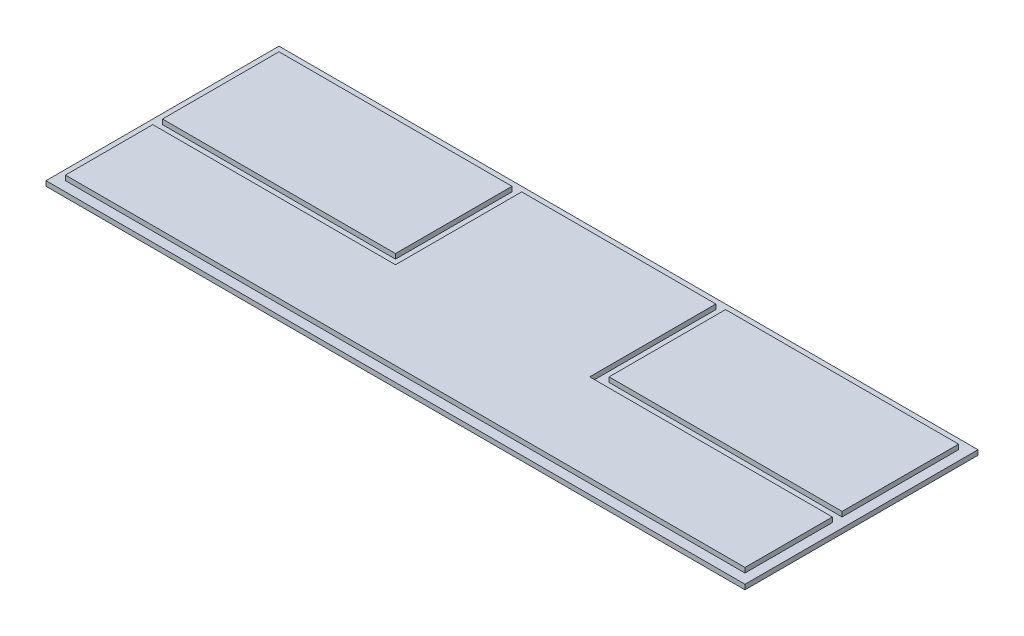
ISO-10303-21;
HEADER;
FILE_DESCRIPTION(('STEP AP214'),'2;1');
FILE_NAME('part.step','',(''),(''),'','','');
FILE_SCHEMA(('AUTOMOTIVE_DESIGN { 1 0 10303 214 1 1 1 1 }'));
ENDSEC;
DATA;
#1=APPLICATION_CONTEXT('core data for automotive mechanical design processes');
#2=APPLICATION_PROTOCOL_DEFINITION('international standard','automotive_design',2000,#1);
#3=PRODUCT_CONTEXT('',#1,'mechanical');
#4=PRODUCT('Part','Part','',(#3));
#5=PRODUCT_RELATED_PRODUCT_CATEGORY('part','',(#4));
#6=PRODUCT_DEFINITION_FORMATION('','',#4);
#7=PRODUCT_DEFINITION_CONTEXT('part definition',#1,'design');
#8=PRODUCT_DEFINITION('design','',#6,#7);
#9=PRODUCT_DEFINITION_SHAPE('','',#8);
#10=(LENGTH_UNIT() NAMED_UNIT(*) SI_UNIT(.MILLI.,.METRE.));
#11=(NAMED_UNIT(*) PLANE_ANGLE_UNIT() SI_UNIT($,.RADIAN.));
#12=(NAMED_UNIT(*) SI_UNIT($,.STERADIAN.) SOLID_ANGLE_UNIT());
#13=UNCERTAINTY_MEASURE_WITH_UNIT(LENGTH_MEASURE(1.E-05),#10,'distance_accuracy_value','');
#14=(GEOMETRIC_REPRESENTATION_CONTEXT(3) GLOBAL_UNCERTAINTY_ASSIGNED_CONTEXT((#13)) GLOBAL_UNIT_ASSIGNED_CONTEXT((#10,
#11,#12)) REPRESENTATION_CONTEXT('',''));
#15=CARTESIAN_POINT('',(0.,0.,0.));
#16=DIRECTION('',(0.,0.,1.));
#17=DIRECTION('',(1.,0.,0.));
#18=AXIS2_PLACEMENT_3D('',#15,#16,#17);
#19=CARTESIAN_POINT('',(0.,12.7,0.));
#20=DIRECTION('',(1.,0.,0.));
#21=DIRECTION('',(0.,0.,-1.));
#22=AXIS2_PLACEMENT_3D('',#19,#20,#21);
#23=PLANE('',#22);
#24=DIRECTION('',(0.,-1.,0.));
#25=VECTOR('',#24,1.);
#26=CARTESIAN_POINT('',(0.,12.7,0.));
#27=LINE('',#26,#25);
#28=CARTESIAN_POINT('',(0.,6.35,0.));
#29=VERTEX_POINT('',#28);
#30=CARTESIAN_POINT('',(0.,0.,0.));
#31=VERTEX_POINT('',#30);
#32=EDGE_CURVE('E12',#29,#31,#27,.T.);
#33=ORIENTED_EDGE('',*,*,#32,.F.);
#34=DIRECTION('',(0.,0.,1.));
#35=VECTOR('',#34,1.);
#36=CARTESIAN_POINT('',(0.,6.35,-304.8));
#37=LINE('',#36,#35);
#38=CARTESIAN_POINT('',(0.,6.35,-304.8));
#39=VERTEX_POINT('',#38);
#40=EDGE_CURVE('E290',#39,#29,#37,.T.);
#41=ORIENTED_EDGE('',*,*,#40,.F.);
#42=DIRECTION('',(0.,-1.,0.));
#43=VECTOR('',#42,1.);
#44=CARTESIAN_POINT('',(0.,12.7,-304.8));
#45=LINE('',#44,#43);
#46=CARTESIAN_POINT('',(0.,0.,-304.8));
#47=VERTEX_POINT('',#46);
#48=EDGE_CURVE('E308',#39,#47,#45,.T.);
#49=ORIENTED_EDGE('',*,*,#48,.T.);
#50=DIRECTION('',(0.,0.,1.));
#51=VECTOR('',#50,1.);
#52=CARTESIAN_POINT('',(0.,0.,0.));
#53=LINE('',#52,#51);
#54=EDGE_CURVE('E295',#47,#31,#53,.T.);
#55=ORIENTED_EDGE('',*,*,#54,.T.);
#56=EDGE_LOOP('',(#33,#41,#49,#55));
#57=FACE_BOUND('',#56,.T.);
#58=ADVANCED_FACE('F43',(#57),#23,.F.);
#59=CARTESIAN_POINT('',(0.,12.7,0.));
#60=DIRECTION('',(0.,0.,-1.));
#61=DIRECTION('',(-1.,0.,0.));
#62=AXIS2_PLACEMENT_3D('',#59,#60,#61);
#63=PLANE('',#62);
#64=DIRECTION('',(0.,-1.,0.));
#65=VECTOR('',#64,1.);
#66=CARTESIAN_POINT('',(914.4,12.7,0.));
#67=LINE('',#66,#65);
#68=CARTESIAN_POINT('',(914.4,6.35,0.));
#69=VERTEX_POINT('',#68);
#70=CARTESIAN_POINT('',(914.4,0.,0.));
#71=VERTEX_POINT('',#70);
#72=EDGE_CURVE('E50',#69,#71,#67,.T.);
#73=ORIENTED_EDGE('',*,*,#72,.F.);
#74=DIRECTION('',(1.,0.,0.));
#75=VECTOR('',#74,1.);
#76=CARTESIAN_POINT('',(0.,6.35,0.));
#77=LINE('',#76,#75);
#78=EDGE_CURVE('E292',#29,#69,#77,.T.);
#79=ORIENTED_EDGE('',*,*,#78,.F.);
#80=ORIENTED_EDGE('',*,*,#32,.T.);
#81=DIRECTION('',(1.,0.,0.));
#82=VECTOR('',#81,1.);
#83=CARTESIAN_POINT('',(0.,0.,0.));
#84=LINE('',#83,#82);
#85=EDGE_CURVE('E298',#31,#71,#84,.T.);
#86=ORIENTED_EDGE('',*,*,#85,.T.);
#87=EDGE_LOOP('',(#73,#79,#80,#86));
#88=FACE_BOUND('',#87,.T.);
#89=ADVANCED_FACE('F320',(#88),#63,.F.);
#90=CARTESIAN_POINT('',(914.4,12.7,0.));
#91=DIRECTION('',(-1.,0.,0.));
#92=DIRECTION('',(0.,0.,1.));
#93=AXIS2_PLACEMENT_3D('',#90,#91,#92);
#94=PLANE('',#93);
#95=DIRECTION('',(0.,-1.,0.));
#96=VECTOR('',#95,1.);
#97=CARTESIAN_POINT('',(914.4,12.7,-304.8));
#98=LINE('',#97,#96);
#99=CARTESIAN_POINT('',(914.4,6.35,-304.8));
#100=VERTEX_POINT('',#99);
#101=CARTESIAN_POINT('',(914.4,0.,-304.8));
#102=VERTEX_POINT('',#101);
#103=EDGE_CURVE('E310',#100,#102,#98,.T.);
#104=ORIENTED_EDGE('',*,*,#103,.F.);
#105=DIRECTION('',(0.,0.,-1.));
#106=VECTOR('',#105,1.);
#107=CARTESIAN_POINT('',(914.4,6.35,-304.8));
#108=LINE('',#107,#106);
#109=EDGE_CURVE('E57',#69,#100,#108,.T.);
#110=ORIENTED_EDGE('',*,*,#109,.F.);
#111=ORIENTED_EDGE('',*,*,#72,.T.);
#112=DIRECTION('',(0.,0.,-1.));
#113=VECTOR('',#112,1.);
#114=CARTESIAN_POINT('',(914.4,0.,0.));
#115=LINE('',#114,#113);
#116=EDGE_CURVE('E301',#71,#102,#115,.T.);
#117=ORIENTED_EDGE('',*,*,#116,.T.);
#118=EDGE_LOOP('',(#104,#110,#111,#117));
#119=FACE_BOUND('',#118,.T.);
#120=ADVANCED_FACE('F314',(#119),#94,.F.);
#121=CARTESIAN_POINT('',(0.,12.7,-304.8));
#122=DIRECTION('',(0.,0.,1.));
#123=DIRECTION('',(1.,0.,0.));
#124=AXIS2_PLACEMENT_3D('',#121,#122,#123);
#125=PLANE('',#124);
#126=ORIENTED_EDGE('',*,*,#48,.F.);
#127=DIRECTION('',(-1.,0.,0.));
#128=VECTOR('',#127,1.);
#129=CARTESIAN_POINT('',(0.,6.35,-304.8));
#130=LINE('',#129,#128);
#131=EDGE_CURVE('E283',#100,#39,#130,.T.);
#132=ORIENTED_EDGE('',*,*,#131,.F.);
#133=ORIENTED_EDGE('',*,*,#103,.T.);
#134=DIRECTION('',(-1.,0.,0.));
#135=VECTOR('',#134,1.);
#136=CARTESIAN_POINT('',(0.,0.,-304.8));
#137=LINE('',#136,#135);
#138=EDGE_CURVE('E303',#102,#47,#137,.T.);
#139=ORIENTED_EDGE('',*,*,#138,.T.);
#140=EDGE_LOOP('',(#126,#132,#133,#139));
#141=FACE_BOUND('',#140,.T.);
#142=ADVANCED_FACE('F327',(#141),#125,.F.);
#143=CARTESIAN_POINT('',(0.,0.,0.));
#144=DIRECTION('',(0.,-1.,0.));
#145=DIRECTION('',(0.,0.,-1.));
#146=AXIS2_PLACEMENT_3D('',#143,#144,#145);
#147=PLANE('',#146);
#148=ORIENTED_EDGE('',*,*,#54,.F.);
#149=ORIENTED_EDGE('',*,*,#138,.F.);
#150=ORIENTED_EDGE('',*,*,#116,.F.);
#151=ORIENTED_EDGE('',*,*,#85,.F.);
#152=EDGE_LOOP('',(#148,#149,#150,#151));
#153=FACE_BOUND('',#152,.T.);
#154=ADVANCED_FACE('F324',(#153),#147,.T.);
#155=CARTESIAN_POINT('',(0.,6.35,0.));
#156=DIRECTION('',(0.,-1.,0.));
#157=DIRECTION('',(0.,0.,-1.));
#158=AXIS2_PLACEMENT_3D('',#155,#156,#157);
#159=PLANE('',#158);
#160=DIRECTION('',(0.,0.,1.));
#161=VECTOR('',#160,1.);
#162=CARTESIAN_POINT('',(330.2,6.35,-292.1));
#163=LINE('',#162,#161);
#164=CARTESIAN_POINT('',(330.2,6.35,-292.1));
#165=VERTEX_POINT('',#164);
#166=CARTESIAN_POINT('',(330.2,6.35,-127.));
#167=VERTEX_POINT('',#166);
#168=EDGE_CURVE('E198',#165,#167,#163,.T.);
#169=ORIENTED_EDGE('',*,*,#168,.F.);
#170=DIRECTION('',(-1.,0.,0.));
#171=VECTOR('',#170,1.);
#172=CARTESIAN_POINT('',(330.2,6.35,-292.1));
#173=LINE('',#172,#171);
#174=CARTESIAN_POINT('',(584.2,6.35,-292.1));
#175=VERTEX_POINT('',#174);
#176=EDGE_CURVE('E191',#175,#165,#173,.T.);
#177=ORIENTED_EDGE('',*,*,#176,.F.);
#178=DIRECTION('',(0.,0.,-1.));
#179=VECTOR('',#178,1.);
#180=CARTESIAN_POINT('',(584.2,6.35,-292.1));
#181=LINE('',#180,#179);
#182=CARTESIAN_POINT('',(584.2,6.35,-127.));
#183=VERTEX_POINT('',#182);
#184=EDGE_CURVE('E621',#183,#175,#181,.T.);
#185=ORIENTED_EDGE('',*,*,#184,.F.);
#186=DIRECTION('',(-1.,0.,0.));
#187=VECTOR('',#186,1.);
#188=CARTESIAN_POINT('',(901.7,6.35,-127.));
#189=LINE('',#188,#187);
#190=CARTESIAN_POINT('',(901.7,6.35,-127.));
#191=VERTEX_POINT('',#190);
#192=EDGE_CURVE('E618',#191,#183,#189,.T.);
#193=ORIENTED_EDGE('',*,*,#192,.F.);
#194=DIRECTION('',(0.,0.,-1.));
#195=VECTOR('',#194,1.);
#196=CARTESIAN_POINT('',(901.7,6.35,-12.7));
#197=LINE('',#196,#195);
#198=CARTESIAN_POINT('',(901.7,6.35,-12.7));
#199=VERTEX_POINT('',#198);
#200=EDGE_CURVE('E220',#199,#191,#197,.T.);
#201=ORIENTED_EDGE('',*,*,#200,.F.);
#202=DIRECTION('',(1.,0.,0.));
#203=VECTOR('',#202,1.);
#204=CARTESIAN_POINT('',(12.7,6.35,-12.7));
#205=LINE('',#204,#203);
#206=CARTESIAN_POINT('',(12.7,6.35,-12.7));
#207=VERTEX_POINT('',#206);
#208=EDGE_CURVE('E215',#207,#199,#205,.T.);
#209=ORIENTED_EDGE('',*,*,#208,.F.);
#210=DIRECTION('',(0.,0.,1.));
#211=VECTOR('',#210,1.);
#212=CARTESIAN_POINT('',(12.7000000000001,6.35,-127.));
#213=LINE('',#212,#211);
#214=CARTESIAN_POINT('',(12.7000000000001,6.35,-127.));
#215=VERTEX_POINT('',#214);
#216=EDGE_CURVE('E202',#215,#207,#213,.T.);
#217=ORIENTED_EDGE('',*,*,#216,.F.);
#218=DIRECTION('',(-1.,0.,0.));
#219=VECTOR('',#218,1.);
#220=CARTESIAN_POINT('',(330.2,6.35,-127.));
#221=LINE('',#220,#219);
#222=EDGE_CURVE('E183',#167,#215,#221,.T.);
#223=ORIENTED_EDGE('',*,*,#222,.F.);
#224=EDGE_LOOP('',(#169,#177,#185,#193,#201,#209,#217,#223));
#225=FACE_BOUND('',#224,.T.);
#226=DIRECTION('',(0.,0.,1.));
#227=VECTOR('',#226,1.);
#228=CARTESIAN_POINT('',(596.9,6.35,-292.1));
#229=LINE('',#228,#227);
#230=CARTESIAN_POINT('',(596.9,6.35,-292.1));
#231=VERTEX_POINT('',#230);
#232=CARTESIAN_POINT('',(596.9,6.35,-139.7));
#233=VERTEX_POINT('',#232);
#234=EDGE_CURVE('E248',#231,#233,#229,.T.);
#235=ORIENTED_EDGE('',*,*,#234,.F.);
#236=DIRECTION('',(-1.,0.,0.));
#237=VECTOR('',#236,1.);
#238=CARTESIAN_POINT('',(596.9,6.35,-292.1));
#239=LINE('',#238,#237);
#240=CARTESIAN_POINT('',(901.7,6.35,-292.1));
#241=VERTEX_POINT('',#240);
#242=EDGE_CURVE('E227',#241,#231,#239,.T.);
#243=ORIENTED_EDGE('',*,*,#242,.F.);
#244=DIRECTION('',(0.,0.,-1.));
#245=VECTOR('',#244,1.);
#246=CARTESIAN_POINT('',(901.7,6.35,-292.1));
#247=LINE('',#246,#245);
#248=CARTESIAN_POINT('',(901.7,6.35,-139.7));
#249=VERTEX_POINT('',#248);
#250=EDGE_CURVE('E234',#249,#241,#247,.T.);
#251=ORIENTED_EDGE('',*,*,#250,.F.);
#252=DIRECTION('',(1.,0.,0.));
#253=VECTOR('',#252,1.);
#254=CARTESIAN_POINT('',(596.9,6.35,-139.7));
#255=LINE('',#254,#253);
#256=EDGE_CURVE('E438',#233,#249,#255,.T.);
#257=ORIENTED_EDGE('',*,*,#256,.F.);
#258=EDGE_LOOP('',(#235,#243,#251,#257));
#259=FACE_BOUND('',#258,.T.);
#260=DIRECTION('',(0.,0.,-1.));
#261=VECTOR('',#260,1.);
#262=CARTESIAN_POINT('',(317.5,6.35,-292.1));
#263=LINE('',#262,#261);
#264=CARTESIAN_POINT('',(317.5,6.35,-139.7));
#265=VERTEX_POINT('',#264);
#266=CARTESIAN_POINT('',(317.5,6.35,-292.1));
#267=VERTEX_POINT('',#266);
#268=EDGE_CURVE('E258',#265,#267,#263,.T.);
#269=ORIENTED_EDGE('',*,*,#268,.F.);
#270=DIRECTION('',(1.,0.,0.));
#271=VECTOR('',#270,1.);
#272=CARTESIAN_POINT('',(317.5,6.35,-139.7));
#273=LINE('',#272,#271);
#274=CARTESIAN_POINT('',(12.7,6.35,-139.7));
#275=VERTEX_POINT('',#274);
#276=EDGE_CURVE('E269',#275,#265,#273,.T.);
#277=ORIENTED_EDGE('',*,*,#276,.F.);
#278=DIRECTION('',(0.,0.,1.));
#279=VECTOR('',#278,1.);
#280=CARTESIAN_POINT('',(12.7,6.35,-292.1));
#281=LINE('',#280,#279);
#282=CARTESIAN_POINT('',(12.7,6.35,-292.1));
#283=VERTEX_POINT('',#282);
#284=EDGE_CURVE('E266',#283,#275,#281,.T.);
#285=ORIENTED_EDGE('',*,*,#284,.F.);
#286=DIRECTION('',(-1.,0.,0.));
#287=VECTOR('',#286,1.);
#288=CARTESIAN_POINT('',(12.7,6.35,-292.1));
#289=LINE('',#288,#287);
#290=EDGE_CURVE('E260',#267,#283,#289,.T.);
#291=ORIENTED_EDGE('',*,*,#290,.F.);
#292=EDGE_LOOP('',(#269,#277,#285,#291));
#293=FACE_BOUND('',#292,.T.);
#294=ORIENTED_EDGE('',*,*,#131,.T.);
#295=ORIENTED_EDGE('',*,*,#40,.T.);
#296=ORIENTED_EDGE('',*,*,#78,.T.);
#297=ORIENTED_EDGE('',*,*,#109,.T.);
#298=EDGE_LOOP('',(#294,#295,#296,#297));
#299=FACE_BOUND('',#298,.T.);
#300=ADVANCED_FACE('F195',(#225,#259,#293,#299),#159,.F.);
#301=CARTESIAN_POINT('',(317.5,6.35,-292.1));
#302=DIRECTION('',(1.,0.,0.));
#303=DIRECTION('',(0.,0.,-1.));
#304=AXIS2_PLACEMENT_3D('',#301,#302,#303);
#305=PLANE('',#304);
#306=DIRECTION('',(0.,0.,-1.));
#307=VECTOR('',#306,1.);
#308=CARTESIAN_POINT('',(317.5,12.7,-292.1));
#309=LINE('',#308,#307);
#310=CARTESIAN_POINT('',(317.5,12.7,-139.7));
#311=VERTEX_POINT('',#310);
#312=CARTESIAN_POINT('',(317.5,12.7,-292.1));
#313=VERTEX_POINT('',#312);
#314=EDGE_CURVE('E251',#311,#313,#309,.T.);
#315=ORIENTED_EDGE('',*,*,#314,.F.);
#316=DIRECTION('',(0.,1.,0.));
#317=VECTOR('',#316,1.);
#318=CARTESIAN_POINT('',(317.5,6.35,-139.7));
#319=LINE('',#318,#317);
#320=EDGE_CURVE('E281',#265,#311,#319,.T.);
#321=ORIENTED_EDGE('',*,*,#320,.F.);
#322=ORIENTED_EDGE('',*,*,#268,.T.);
#323=DIRECTION('',(0.,1.,0.));
#324=VECTOR('',#323,1.);
#325=CARTESIAN_POINT('',(317.5,6.35,-292.1));
#326=LINE('',#325,#324);
#327=EDGE_CURVE('E272',#267,#313,#326,.T.);
#328=ORIENTED_EDGE('',*,*,#327,.T.);
#329=EDGE_LOOP('',(#315,#321,#322,#328));
#330=FACE_BOUND('',#329,.T.);
#331=ADVANCED_FACE('F351',(#330),#305,.T.);
#332=CARTESIAN_POINT('',(317.5,6.35,-139.7));
#333=DIRECTION('',(0.,0.,1.));
#334=DIRECTION('',(1.,0.,0.));
#335=AXIS2_PLACEMENT_3D('',#332,#333,#334);
#336=PLANE('',#335);
#337=DIRECTION('',(1.,0.,0.));
#338=VECTOR('',#337,1.);
#339=CARTESIAN_POINT('',(317.5,12.7,-139.7));
#340=LINE('',#339,#338);
#341=CARTESIAN_POINT('',(12.7,12.7,-139.7));
#342=VERTEX_POINT('',#341);
#343=EDGE_CURVE('E261',#342,#311,#340,.T.);
#344=ORIENTED_EDGE('',*,*,#343,.F.);
#345=DIRECTION('',(0.,1.,0.));
#346=VECTOR('',#345,1.);
#347=CARTESIAN_POINT('',(12.7,6.35,-139.7));
#348=LINE('',#347,#346);
#349=EDGE_CURVE('E284',#275,#342,#348,.T.);
#350=ORIENTED_EDGE('',*,*,#349,.F.);
#351=ORIENTED_EDGE('',*,*,#276,.T.);
#352=ORIENTED_EDGE('',*,*,#320,.T.);
#353=EDGE_LOOP('',(#344,#350,#351,#352));
#354=FACE_BOUND('',#353,.T.);
#355=ADVANCED_FACE('F354',(#354),#336,.T.);
#356=CARTESIAN_POINT('',(12.7,6.35,-292.1));
#357=DIRECTION('',(-1.,0.,0.));
#358=DIRECTION('',(0.,0.,1.));
#359=AXIS2_PLACEMENT_3D('',#356,#357,#358);
#360=PLANE('',#359);
#361=DIRECTION('',(0.,0.,1.));
#362=VECTOR('',#361,1.);
#363=CARTESIAN_POINT('',(12.7,12.7,-292.1));
#364=LINE('',#363,#362);
#365=CARTESIAN_POINT('',(12.7,12.7,-292.1));
#366=VERTEX_POINT('',#365);
#367=EDGE_CURVE('E65',#366,#342,#364,.T.);
#368=ORIENTED_EDGE('',*,*,#367,.F.);
#369=DIRECTION('',(0.,1.,0.));
#370=VECTOR('',#369,1.);
#371=CARTESIAN_POINT('',(12.7,6.35,-292.1));
#372=LINE('',#371,#370);
#373=EDGE_CURVE('E286',#283,#366,#372,.T.);
#374=ORIENTED_EDGE('',*,*,#373,.F.);
#375=ORIENTED_EDGE('',*,*,#284,.T.);
#376=ORIENTED_EDGE('',*,*,#349,.T.);
#377=EDGE_LOOP('',(#368,#374,#375,#376));
#378=FACE_BOUND('',#377,.T.);
#379=ADVANCED_FACE('F360',(#378),#360,.T.);
#380=CARTESIAN_POINT('',(12.7,6.35,-292.1));
#381=DIRECTION('',(0.,0.,-1.));
#382=DIRECTION('',(-1.,0.,0.));
#383=AXIS2_PLACEMENT_3D('',#380,#381,#382);
#384=PLANE('',#383);
#385=DIRECTION('',(-1.,0.,0.));
#386=VECTOR('',#385,1.);
#387=CARTESIAN_POINT('',(12.7,12.7,-292.1));
#388=LINE('',#387,#386);
#389=EDGE_CURVE('E275',#313,#366,#388,.T.);
#390=ORIENTED_EDGE('',*,*,#389,.F.);
#391=ORIENTED_EDGE('',*,*,#327,.F.);
#392=ORIENTED_EDGE('',*,*,#290,.T.);
#393=ORIENTED_EDGE('',*,*,#373,.T.);
#394=EDGE_LOOP('',(#390,#391,#392,#393));
#395=FACE_BOUND('',#394,.T.);
#396=ADVANCED_FACE('F356',(#395),#384,.T.);
#397=CARTESIAN_POINT('',(596.9,6.35,-292.1));
#398=DIRECTION('',(-1.,0.,0.));
#399=DIRECTION('',(0.,0.,1.));
#400=AXIS2_PLACEMENT_3D('',#397,#398,#399);
#401=PLANE('',#400);
#402=DIRECTION('',(0.,0.,1.));
#403=VECTOR('',#402,1.);
#404=CARTESIAN_POINT('',(596.9,12.7,-292.1));
#405=LINE('',#404,#403);
#406=CARTESIAN_POINT('',(596.9,12.7,-292.1));
#407=VERTEX_POINT('',#406);
#408=CARTESIAN_POINT('',(596.9,12.7,-139.7));
#409=VERTEX_POINT('',#408);
#410=EDGE_CURVE('E236',#407,#409,#405,.T.);
#411=ORIENTED_EDGE('',*,*,#410,.F.);
#412=DIRECTION('',(0.,1.,0.));
#413=VECTOR('',#412,1.);
#414=CARTESIAN_POINT('',(596.9,6.35,-292.1));
#415=LINE('',#414,#413);
#416=EDGE_CURVE('E249',#231,#407,#415,.T.);
#417=ORIENTED_EDGE('',*,*,#416,.F.);
#418=ORIENTED_EDGE('',*,*,#234,.T.);
#419=DIRECTION('',(0.,1.,0.));
#420=VECTOR('',#419,1.);
#421=CARTESIAN_POINT('',(596.9,6.35,-139.7));
#422=LINE('',#421,#420);
#423=EDGE_CURVE('E233',#233,#409,#422,.T.);
#424=ORIENTED_EDGE('',*,*,#423,.T.);
#425=EDGE_LOOP('',(#411,#417,#418,#424));
#426=FACE_BOUND('',#425,.T.);
#427=ADVANCED_FACE('F359',(#426),#401,.T.);
#428=CARTESIAN_POINT('',(596.9,6.35,-292.1));
#429=DIRECTION('',(0.,0.,-1.));
#430=DIRECTION('',(-1.,0.,0.));
#431=AXIS2_PLACEMENT_3D('',#428,#429,#430);
#432=PLANE('',#431);
#433=DIRECTION('',(-1.,0.,0.));
#434=VECTOR('',#433,1.);
#435=CARTESIAN_POINT('',(596.9,12.7,-292.1));
#436=LINE('',#435,#434);
#437=CARTESIAN_POINT('',(901.7,12.7,-292.1));
#438=VERTEX_POINT('',#437);
#439=EDGE_CURVE('E245',#438,#407,#436,.T.);
#440=ORIENTED_EDGE('',*,*,#439,.F.);
#441=DIRECTION('',(0.,1.,0.));
#442=VECTOR('',#441,1.);
#443=CARTESIAN_POINT('',(901.7,6.35,-292.1));
#444=LINE('',#443,#442);
#445=EDGE_CURVE('E252',#241,#438,#444,.T.);
#446=ORIENTED_EDGE('',*,*,#445,.F.);
#447=ORIENTED_EDGE('',*,*,#242,.T.);
#448=ORIENTED_EDGE('',*,*,#416,.T.);
#449=EDGE_LOOP('',(#440,#446,#447,#448));
#450=FACE_BOUND('',#449,.T.);
#451=ADVANCED_FACE('F369',(#450),#432,.T.);
#452=CARTESIAN_POINT('',(901.7,6.35,-292.1));
#453=DIRECTION('',(1.,0.,0.));
#454=DIRECTION('',(0.,0.,-1.));
#455=AXIS2_PLACEMENT_3D('',#452,#453,#454);
#456=PLANE('',#455);
#457=DIRECTION('',(0.,0.,-1.));
#458=VECTOR('',#457,1.);
#459=CARTESIAN_POINT('',(901.7,12.7,-292.1));
#460=LINE('',#459,#458);
#461=CARTESIAN_POINT('',(901.7,12.7,-139.7));
#462=VERTEX_POINT('',#461);
#463=EDGE_CURVE('E242',#462,#438,#460,.T.);
#464=ORIENTED_EDGE('',*,*,#463,.F.);
#465=DIRECTION('',(0.,1.,0.));
#466=VECTOR('',#465,1.);
#467=CARTESIAN_POINT('',(901.7,6.35,-139.7));
#468=LINE('',#467,#466);
#469=EDGE_CURVE('E254',#249,#462,#468,.T.);
#470=ORIENTED_EDGE('',*,*,#469,.F.);
#471=ORIENTED_EDGE('',*,*,#250,.T.);
#472=ORIENTED_EDGE('',*,*,#445,.T.);
#473=EDGE_LOOP('',(#464,#470,#471,#472));
#474=FACE_BOUND('',#473,.T.);
#475=ADVANCED_FACE('F374',(#474),#456,.T.);
#476=CARTESIAN_POINT('',(596.9,6.35,-139.7));
#477=DIRECTION('',(0.,0.,1.));
#478=DIRECTION('',(1.,0.,0.));
#479=AXIS2_PLACEMENT_3D('',#476,#477,#478);
#480=PLANE('',#479);
#481=DIRECTION('',(1.,0.,0.));
#482=VECTOR('',#481,1.);
#483=CARTESIAN_POINT('',(596.9,12.7,-139.7));
#484=LINE('',#483,#482);
#485=EDGE_CURVE('E239',#409,#462,#484,.T.);
#486=ORIENTED_EDGE('',*,*,#485,.F.);
#487=ORIENTED_EDGE('',*,*,#423,.F.);
#488=ORIENTED_EDGE('',*,*,#256,.T.);
#489=ORIENTED_EDGE('',*,*,#469,.T.);
#490=EDGE_LOOP('',(#486,#487,#488,#489));
#491=FACE_BOUND('',#490,.T.);
#492=ADVANCED_FACE('F371',(#491),#480,.T.);
#493=CARTESIAN_POINT('',(330.2,6.35,-292.1));
#494=DIRECTION('',(-1.,0.,0.));
#495=DIRECTION('',(0.,0.,1.));
#496=AXIS2_PLACEMENT_3D('',#493,#494,#495);
#497=PLANE('',#496);
#498=DIRECTION('',(0.,0.,1.));
#499=VECTOR('',#498,1.);
#500=CARTESIAN_POINT('',(330.2,12.7,-292.1));
#501=LINE('',#500,#499);
#502=CARTESIAN_POINT('',(330.2,12.7,-292.1));
#503=VERTEX_POINT('',#502);
#504=CARTESIAN_POINT('',(330.2,12.7,-127.));
#505=VERTEX_POINT('',#504);
#506=EDGE_CURVE('E605',#503,#505,#501,.T.);
#507=ORIENTED_EDGE('',*,*,#506,.F.);
#508=DIRECTION('',(0.,1.,0.));
#509=VECTOR('',#508,1.);
#510=CARTESIAN_POINT('',(330.2,6.35,-292.1));
#511=LINE('',#510,#509);
#512=EDGE_CURVE('E206',#165,#503,#511,.T.);
#513=ORIENTED_EDGE('',*,*,#512,.F.);
#514=ORIENTED_EDGE('',*,*,#168,.T.);
#515=DIRECTION('',(0.,1.,0.));
#516=VECTOR('',#515,1.);
#517=CARTESIAN_POINT('',(330.2,6.35,-127.));
#518=LINE('',#517,#516);
#519=EDGE_CURVE('E179',#167,#505,#518,.T.);
#520=ORIENTED_EDGE('',*,*,#519,.T.);
#521=EDGE_LOOP('',(#507,#513,#514,#520));
#522=FACE_BOUND('',#521,.T.);
#523=ADVANCED_FACE('F205',(#522),#497,.T.);
#524=CARTESIAN_POINT('',(330.2,6.35,-292.1));
#525=DIRECTION('',(0.,0.,-1.));
#526=DIRECTION('',(-1.,0.,0.));
#527=AXIS2_PLACEMENT_3D('',#524,#525,#526);
#528=PLANE('',#527);
#529=DIRECTION('',(-1.,0.,0.));
#530=VECTOR('',#529,1.);
#531=CARTESIAN_POINT('',(330.2,12.7,-292.1));
#532=LINE('',#531,#530);
#533=CARTESIAN_POINT('',(584.2,12.7,-292.1));
#534=VERTEX_POINT('',#533);
#535=EDGE_CURVE('E207',#534,#503,#532,.T.);
#536=ORIENTED_EDGE('',*,*,#535,.F.);
#537=DIRECTION('',(0.,1.,0.));
#538=VECTOR('',#537,1.);
#539=CARTESIAN_POINT('',(584.2,6.35,-292.1));
#540=LINE('',#539,#538);
#541=EDGE_CURVE('E413',#175,#534,#540,.T.);
#542=ORIENTED_EDGE('',*,*,#541,.F.);
#543=ORIENTED_EDGE('',*,*,#176,.T.);
#544=ORIENTED_EDGE('',*,*,#512,.T.);
#545=EDGE_LOOP('',(#536,#542,#543,#544));
#546=FACE_BOUND('',#545,.T.);
#547=ADVANCED_FACE('F384',(#546),#528,.T.);
#548=CARTESIAN_POINT('',(584.2,6.35,-292.1));
#549=DIRECTION('',(1.,0.,0.));
#550=DIRECTION('',(0.,0.,-1.));
#551=AXIS2_PLACEMENT_3D('',#548,#549,#550);
#552=PLANE('',#551);
#553=DIRECTION('',(0.,0.,-1.));
#554=VECTOR('',#553,1.);
#555=CARTESIAN_POINT('',(584.2,12.7,-292.1));
#556=LINE('',#555,#554);
#557=CARTESIAN_POINT('',(584.2,12.7,-127.));
#558=VERTEX_POINT('',#557);
#559=EDGE_CURVE('E211',#558,#534,#556,.T.);
#560=ORIENTED_EDGE('',*,*,#559,.F.);
#561=DIRECTION('',(0.,1.,0.));
#562=VECTOR('',#561,1.);
#563=CARTESIAN_POINT('',(584.2,6.35,-127.));
#564=LINE('',#563,#562);
#565=EDGE_CURVE('E428',#183,#558,#564,.T.);
#566=ORIENTED_EDGE('',*,*,#565,.F.);
#567=ORIENTED_EDGE('',*,*,#184,.T.);
#568=ORIENTED_EDGE('',*,*,#541,.T.);
#569=EDGE_LOOP('',(#560,#566,#567,#568));
#570=FACE_BOUND('',#569,.T.);
#571=ADVANCED_FACE('F402',(#570),#552,.T.);
#572=CARTESIAN_POINT('',(901.7,6.35,-127.));
#573=DIRECTION('',(0.,0.,-1.));
#574=DIRECTION('',(-1.,0.,0.));
#575=AXIS2_PLACEMENT_3D('',#572,#573,#574);
#576=PLANE('',#575);
#577=DIRECTION('',(-1.,0.,0.));
#578=VECTOR('',#577,1.);
#579=CARTESIAN_POINT('',(901.7,12.7,-127.));
#580=LINE('',#579,#578);
#581=CARTESIAN_POINT('',(901.7,12.7,-127.));
#582=VERTEX_POINT('',#581);
#583=EDGE_CURVE('E419',#582,#558,#580,.T.);
#584=ORIENTED_EDGE('',*,*,#583,.F.);
#585=DIRECTION('',(0.,1.,0.));
#586=VECTOR('',#585,1.);
#587=CARTESIAN_POINT('',(901.7,6.35,-127.));
#588=LINE('',#587,#586);
#589=EDGE_CURVE('E430',#191,#582,#588,.T.);
#590=ORIENTED_EDGE('',*,*,#589,.F.);
#591=ORIENTED_EDGE('',*,*,#192,.T.);
#592=ORIENTED_EDGE('',*,*,#565,.T.);
#593=EDGE_LOOP('',(#584,#590,#591,#592));
#594=FACE_BOUND('',#593,.T.);
#595=ADVANCED_FACE('F398',(#594),#576,.T.);
#596=CARTESIAN_POINT('',(901.7,6.35,-12.7));
#597=DIRECTION('',(1.,0.,0.));
#598=DIRECTION('',(0.,0.,-1.));
#599=AXIS2_PLACEMENT_3D('',#596,#597,#598);
#600=PLANE('',#599);
#601=DIRECTION('',(0.,0.,-1.));
#602=VECTOR('',#601,1.);
#603=CARTESIAN_POINT('',(901.7,12.7,-12.7));
#604=LINE('',#603,#602);
#605=CARTESIAN_POINT('',(901.7,12.7,-12.7));
#606=VERTEX_POINT('',#605);
#607=EDGE_CURVE('E421',#606,#582,#604,.T.);
#608=ORIENTED_EDGE('',*,*,#607,.F.);
#609=DIRECTION('',(0.,1.,0.));
#610=VECTOR('',#609,1.);
#611=CARTESIAN_POINT('',(901.7,6.35,-12.7));
#612=LINE('',#611,#610);
#613=EDGE_CURVE('E432',#199,#606,#612,.T.);
#614=ORIENTED_EDGE('',*,*,#613,.F.);
#615=ORIENTED_EDGE('',*,*,#200,.T.);
#616=ORIENTED_EDGE('',*,*,#589,.T.);
#617=EDGE_LOOP('',(#608,#614,#615,#616));
#618=FACE_BOUND('',#617,.T.);
#619=ADVANCED_FACE('F394',(#618),#600,.T.);
#620=CARTESIAN_POINT('',(12.7,6.35,-12.7));
#621=DIRECTION('',(0.,0.,1.));
#622=DIRECTION('',(1.,0.,0.));
#623=AXIS2_PLACEMENT_3D('',#620,#621,#622);
#624=PLANE('',#623);
#625=DIRECTION('',(1.,0.,0.));
#626=VECTOR('',#625,1.);
#627=CARTESIAN_POINT('',(12.7,12.7,-12.7));
#628=LINE('',#627,#626);
#629=CARTESIAN_POINT('',(12.7,12.7,-12.7));
#630=VERTEX_POINT('',#629);
#631=EDGE_CURVE('E607',#630,#606,#628,.T.);
#632=ORIENTED_EDGE('',*,*,#631,.F.);
#633=DIRECTION('',(0.,1.,0.));
#634=VECTOR('',#633,1.);
#635=CARTESIAN_POINT('',(12.7,6.35,-12.7));
#636=LINE('',#635,#634);
#637=EDGE_CURVE('E434',#207,#630,#636,.T.);
#638=ORIENTED_EDGE('',*,*,#637,.F.);
#639=ORIENTED_EDGE('',*,*,#208,.T.);
#640=ORIENTED_EDGE('',*,*,#613,.T.);
#641=EDGE_LOOP('',(#632,#638,#639,#640));
#642=FACE_BOUND('',#641,.T.);
#643=ADVANCED_FACE('F390',(#642),#624,.T.);
#644=CARTESIAN_POINT('',(12.7000000000001,6.35,-127.));
#645=DIRECTION('',(-1.,0.,0.));
#646=DIRECTION('',(0.,0.,1.));
#647=AXIS2_PLACEMENT_3D('',#644,#645,#646);
#648=PLANE('',#647);
#649=DIRECTION('',(0.,0.,1.));
#650=VECTOR('',#649,1.);
#651=CARTESIAN_POINT('',(12.7000000000001,12.7,-127.));
#652=LINE('',#651,#650);
#653=CARTESIAN_POINT('',(12.7000000000001,12.7,-127.));
#654=VERTEX_POINT('',#653);
#655=EDGE_CURVE('E604',#654,#630,#652,.T.);
#656=ORIENTED_EDGE('',*,*,#655,.F.);
#657=DIRECTION('',(0.,1.,0.));
#658=VECTOR('',#657,1.);
#659=CARTESIAN_POINT('',(12.7000000000001,6.35,-127.));
#660=LINE('',#659,#658);
#661=EDGE_CURVE('E190',#215,#654,#660,.T.);
#662=ORIENTED_EDGE('',*,*,#661,.F.);
#663=ORIENTED_EDGE('',*,*,#216,.T.);
#664=ORIENTED_EDGE('',*,*,#637,.T.);
#665=EDGE_LOOP('',(#656,#662,#663,#664));
#666=FACE_BOUND('',#665,.T.);
#667=ADVANCED_FACE('F387',(#666),#648,.T.);
#668=CARTESIAN_POINT('',(330.2,6.35,-127.));
#669=DIRECTION('',(0.,0.,-1.));
#670=DIRECTION('',(-1.,0.,0.));
#671=AXIS2_PLACEMENT_3D('',#668,#669,#670);
#672=PLANE('',#671);
#673=DIRECTION('',(-1.,0.,0.));
#674=VECTOR('',#673,1.);
#675=CARTESIAN_POINT('',(330.2,12.7,-127.));
#676=LINE('',#675,#674);
#677=EDGE_CURVE('E185',#505,#654,#676,.T.);
#678=ORIENTED_EDGE('',*,*,#677,.F.);
#679=ORIENTED_EDGE('',*,*,#519,.F.);
#680=ORIENTED_EDGE('',*,*,#222,.T.);
#681=ORIENTED_EDGE('',*,*,#661,.T.);
#682=EDGE_LOOP('',(#678,#679,#680,#681));
#683=FACE_BOUND('',#682,.T.);
#684=ADVANCED_FACE('F181',(#683),#672,.T.);
#685=CARTESIAN_POINT('',(0.,12.7,0.));
#686=DIRECTION('',(0.,-1.,0.));
#687=DIRECTION('',(0.,0.,-1.));
#688=AXIS2_PLACEMENT_3D('',#685,#686,#687);
#689=PLANE('',#688);
#690=ORIENTED_EDGE('',*,*,#410,.T.);
#691=ORIENTED_EDGE('',*,*,#485,.T.);
#692=ORIENTED_EDGE('',*,*,#463,.T.);
#693=ORIENTED_EDGE('',*,*,#439,.T.);
#694=EDGE_LOOP('',(#690,#691,#692,#693));
#695=FACE_BOUND('',#694,.T.);
#696=ADVANCED_FACE('F347',(#695),#689,.F.);
#697=ORIENTED_EDGE('',*,*,#314,.T.);
#698=ORIENTED_EDGE('',*,*,#389,.T.);
#699=ORIENTED_EDGE('',*,*,#367,.T.);
#700=ORIENTED_EDGE('',*,*,#343,.T.);
#701=EDGE_LOOP('',(#697,#698,#699,#700));
#702=FACE_BOUND('',#701,.T.);
#703=ADVANCED_FACE('F343',(#702),#689,.F.);
#704=ORIENTED_EDGE('',*,*,#506,.T.);
#705=ORIENTED_EDGE('',*,*,#677,.T.);
#706=ORIENTED_EDGE('',*,*,#655,.T.);
#707=ORIENTED_EDGE('',*,*,#631,.T.);
#708=ORIENTED_EDGE('',*,*,#607,.T.);
#709=ORIENTED_EDGE('',*,*,#583,.T.);
#710=ORIENTED_EDGE('',*,*,#559,.T.);
#711=ORIENTED_EDGE('',*,*,#535,.T.);
#712=EDGE_LOOP('',(#704,#705,#706,#707,#708,#709,#710,#711));
#713=FACE_BOUND('',#712,.T.);
#714=ADVANCED_FACE('F346',(#713),#689,.F.);
#715=CLOSED_SHELL('',(#58,#89,#120,#142,#154,#300,#331,#355,#379,#396,#427,#451,#475,#492,#523,
#547,#571,#595,#619,#643,#667,#684,#696,#703,#714));
#716=MANIFOLD_SOLID_BREP('B2',#715);
#717=ADVANCED_BREP_SHAPE_REPRESENTATION('',(#18,#716),#14);
#718=SHAPE_DEFINITION_REPRESENTATION(#9,#717);
ENDSEC;
END-ISO-10303-21;
